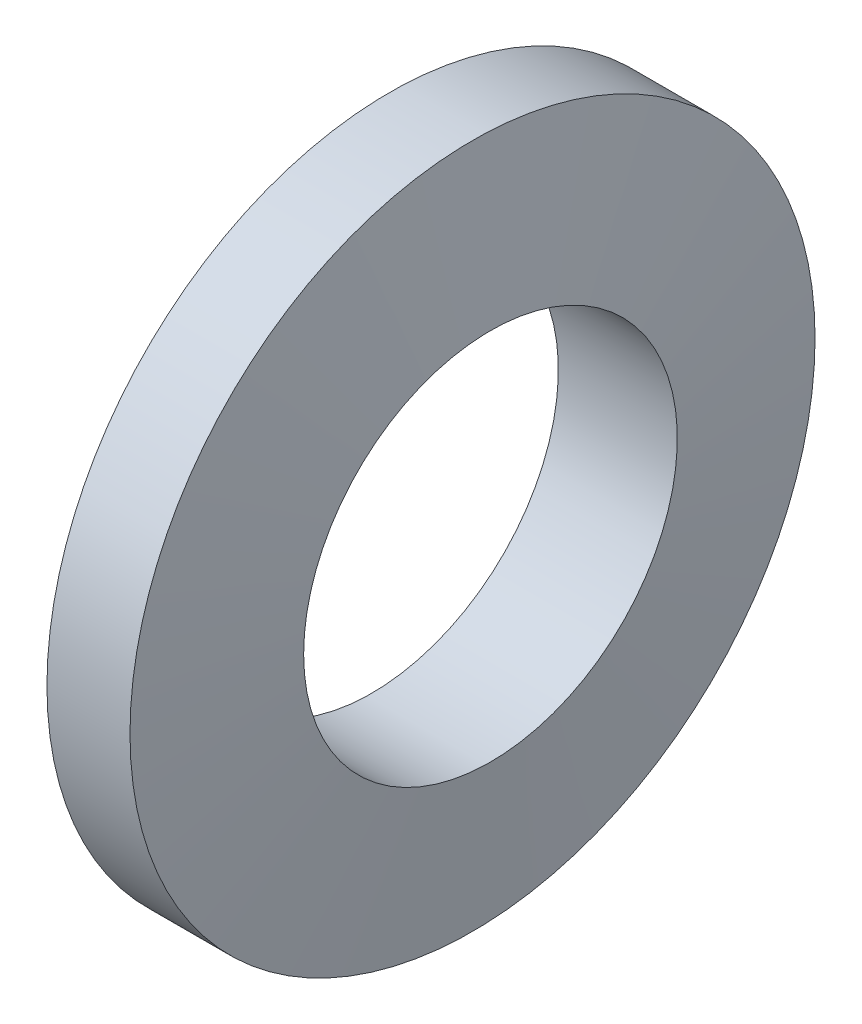
ISO-10303-21;
HEADER;
FILE_DESCRIPTION(('STEP AP214'),'2;1');
FILE_NAME('part.step','',(''),(''),'','','');
FILE_SCHEMA(('AUTOMOTIVE_DESIGN { 1 0 10303 214 1 1 1 1 }'));
ENDSEC;
DATA;
#1=APPLICATION_CONTEXT('core data for automotive mechanical design processes');
#2=APPLICATION_PROTOCOL_DEFINITION('international standard','automotive_design',2000,#1);
#3=PRODUCT_CONTEXT('',#1,'mechanical');
#4=PRODUCT('Part','Part','',(#3));
#5=PRODUCT_RELATED_PRODUCT_CATEGORY('part','',(#4));
#6=PRODUCT_DEFINITION_FORMATION('','',#4);
#7=PRODUCT_DEFINITION_CONTEXT('part definition',#1,'design');
#8=PRODUCT_DEFINITION('design','',#6,#7);
#9=PRODUCT_DEFINITION_SHAPE('','',#8);
#10=(LENGTH_UNIT() NAMED_UNIT(*) SI_UNIT(.MILLI.,.METRE.));
#11=(NAMED_UNIT(*) PLANE_ANGLE_UNIT() SI_UNIT($,.RADIAN.));
#12=(NAMED_UNIT(*) SI_UNIT($,.STERADIAN.) SOLID_ANGLE_UNIT());
#13=UNCERTAINTY_MEASURE_WITH_UNIT(LENGTH_MEASURE(1.E-05),#10,'distance_accuracy_value','');
#14=(GEOMETRIC_REPRESENTATION_CONTEXT(3) GLOBAL_UNCERTAINTY_ASSIGNED_CONTEXT((#13)) GLOBAL_UNIT_ASSIGNED_CONTEXT((#10,
#11,#12)) REPRESENTATION_CONTEXT('',''));
#15=CARTESIAN_POINT('',(0.,0.,0.));
#16=DIRECTION('',(0.,0.,1.));
#17=DIRECTION('',(1.,0.,0.));
#18=AXIS2_PLACEMENT_3D('',#15,#16,#17);
#19=CARTESIAN_POINT('',(2.86538461538462,0.,0.));
#20=DIRECTION('',(-1.,0.,0.));
#21=DIRECTION('',(0.,0.,1.));
#22=AXIS2_PLACEMENT_3D('',#19,#20,#21);
#23=CONICAL_SURFACE('',#22,9.,1.455919721378);
#24=CARTESIAN_POINT('',(2.,0.,0.));
#25=DIRECTION('',(-1.,0.,0.));
#26=DIRECTION('',(0.,0.,1.));
#27=AXIS2_PLACEMENT_3D('',#24,#25,#26);
#28=CIRCLE('',#27,16.5);
#29=CARTESIAN_POINT('',(2.,0.,16.5));
#30=VERTEX_POINT('',#29);
#31=EDGE_CURVE('E62',#30,#30,#28,.T.);
#32=ORIENTED_EDGE('',*,*,#31,.F.);
#33=EDGE_LOOP('',(#32));
#34=FACE_BOUND('',#33,.T.);
#35=CARTESIAN_POINT('',(2.86538461538462,0.,0.));
#36=DIRECTION('',(-1.,0.,0.));
#37=DIRECTION('',(0.,0.,1.));
#38=AXIS2_PLACEMENT_3D('',#35,#36,#37);
#39=CIRCLE('',#38,9.);
#40=CARTESIAN_POINT('',(2.86538461538462,0.,9.));
#41=VERTEX_POINT('',#40);
#42=EDGE_CURVE('E10',#41,#41,#39,.T.);
#43=ORIENTED_EDGE('',*,*,#42,.T.);
#44=EDGE_LOOP('',(#43));
#45=FACE_BOUND('',#44,.T.);
#46=ADVANCED_FACE('F43',(#34,#45),#23,.T.);
#47=CARTESIAN_POINT('',(0.,0.,0.));
#48=DIRECTION('',(-1.,0.,0.));
#49=DIRECTION('',(0.,0.,1.));
#50=AXIS2_PLACEMENT_3D('',#47,#48,#49);
#51=CYLINDRICAL_SURFACE('',#50,9.);
#52=ORIENTED_EDGE('',*,*,#42,.F.);
#53=EDGE_LOOP('',(#52));
#54=FACE_BOUND('',#53,.T.);
#55=CARTESIAN_POINT('',(-2.86538461538462,0.,0.));
#56=DIRECTION('',(-1.,0.,0.));
#57=DIRECTION('',(0.,0.,1.));
#58=AXIS2_PLACEMENT_3D('',#55,#56,#57);
#59=CIRCLE('',#58,9.);
#60=CARTESIAN_POINT('',(-2.86538461538462,0.,9.));
#61=VERTEX_POINT('',#60);
#62=EDGE_CURVE('E50',#61,#61,#59,.T.);
#63=ORIENTED_EDGE('',*,*,#62,.T.);
#64=EDGE_LOOP('',(#63));
#65=FACE_BOUND('',#64,.T.);
#66=ADVANCED_FACE('F73',(#54,#65),#51,.F.);
#67=CARTESIAN_POINT('',(-2.,0.,0.));
#68=DIRECTION('',(1.,0.,0.));
#69=DIRECTION('',(0.,0.,-1.));
#70=AXIS2_PLACEMENT_3D('',#67,#68,#69);
#71=CONICAL_SURFACE('',#70,16.5,1.455919721378);
#72=ORIENTED_EDGE('',*,*,#62,.F.);
#73=EDGE_LOOP('',(#72));
#74=FACE_BOUND('',#73,.T.);
#75=CARTESIAN_POINT('',(-2.,0.,0.));
#76=DIRECTION('',(-1.,0.,0.));
#77=DIRECTION('',(0.,0.,1.));
#78=AXIS2_PLACEMENT_3D('',#75,#76,#77);
#79=CIRCLE('',#78,16.5);
#80=CARTESIAN_POINT('',(-2.,0.,16.5));
#81=VERTEX_POINT('',#80);
#82=EDGE_CURVE('E56',#81,#81,#79,.T.);
#83=ORIENTED_EDGE('',*,*,#82,.T.);
#84=EDGE_LOOP('',(#83));
#85=FACE_BOUND('',#84,.T.);
#86=ADVANCED_FACE('F77',(#74,#85),#71,.T.);
#87=CARTESIAN_POINT('',(0.,0.,0.));
#88=DIRECTION('',(-1.,0.,0.));
#89=DIRECTION('',(0.,0.,1.));
#90=AXIS2_PLACEMENT_3D('',#87,#88,#89);
#91=CYLINDRICAL_SURFACE('',#90,16.5);
#92=ORIENTED_EDGE('',*,*,#82,.F.);
#93=EDGE_LOOP('',(#92));
#94=FACE_BOUND('',#93,.T.);
#95=ORIENTED_EDGE('',*,*,#31,.T.);
#96=EDGE_LOOP('',(#95));
#97=FACE_BOUND('',#96,.T.);
#98=ADVANCED_FACE('F70',(#94,#97),#91,.T.);
#99=CLOSED_SHELL('',(#46,#66,#86,#98));
#100=MANIFOLD_SOLID_BREP('B2',#99);
#101=ADVANCED_BREP_SHAPE_REPRESENTATION('',(#18,#100),#14);
#102=SHAPE_DEFINITION_REPRESENTATION(#9,#101);
ENDSEC;
END-ISO-10303-21;
